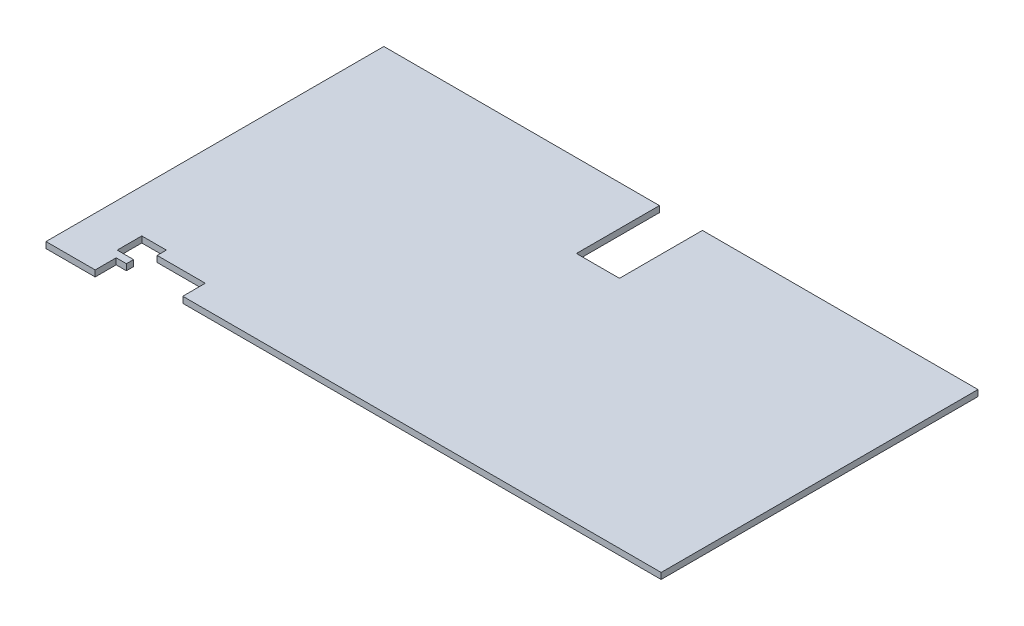
ISO-10303-21;
HEADER;
FILE_DESCRIPTION(('STEP AP214'),'2;1');
FILE_NAME('part.step','',(''),(''),'','','');
FILE_SCHEMA(('AUTOMOTIVE_DESIGN { 1 0 10303 214 1 1 1 1 }'));
ENDSEC;
DATA;
#1=APPLICATION_CONTEXT('core data for automotive mechanical design processes');
#2=APPLICATION_PROTOCOL_DEFINITION('international standard','automotive_design',2000,#1);
#3=PRODUCT_CONTEXT('',#1,'mechanical');
#4=PRODUCT('Part','Part','',(#3));
#5=PRODUCT_RELATED_PRODUCT_CATEGORY('part','',(#4));
#6=PRODUCT_DEFINITION_FORMATION('','',#4);
#7=PRODUCT_DEFINITION_CONTEXT('part definition',#1,'design');
#8=PRODUCT_DEFINITION('design','',#6,#7);
#9=PRODUCT_DEFINITION_SHAPE('','',#8);
#10=(LENGTH_UNIT() NAMED_UNIT(*) SI_UNIT(.MILLI.,.METRE.));
#11=(NAMED_UNIT(*) PLANE_ANGLE_UNIT() SI_UNIT($,.RADIAN.));
#12=(NAMED_UNIT(*) SI_UNIT($,.STERADIAN.) SOLID_ANGLE_UNIT());
#13=UNCERTAINTY_MEASURE_WITH_UNIT(LENGTH_MEASURE(1.E-05),#10,'distance_accuracy_value','');
#14=(GEOMETRIC_REPRESENTATION_CONTEXT(3) GLOBAL_UNCERTAINTY_ASSIGNED_CONTEXT((#13)) GLOBAL_UNIT_ASSIGNED_CONTEXT((#10,
#11,#12)) REPRESENTATION_CONTEXT('',''));
#15=CARTESIAN_POINT('',(0.,0.,0.));
#16=DIRECTION('',(0.,0.,1.));
#17=DIRECTION('',(1.,0.,0.));
#18=AXIS2_PLACEMENT_3D('',#15,#16,#17);
#19=CARTESIAN_POINT('',(145.,3.,77.325));
#20=DIRECTION('',(0.,0.,-1.));
#21=DIRECTION('',(-1.,0.,0.));
#22=AXIS2_PLACEMENT_3D('',#19,#20,#21);
#23=PLANE('',#22);
#24=DIRECTION('',(0.,1.,0.));
#25=VECTOR('',#24,1.);
#26=CARTESIAN_POINT('',(-88.4999999999999,0.,77.325));
#27=LINE('',#26,#25);
#28=CARTESIAN_POINT('',(-88.4999999999999,0.,77.325));
#29=VERTEX_POINT('',#28);
#30=CARTESIAN_POINT('',(-88.4999999999999,3.,77.325));
#31=VERTEX_POINT('',#30);
#32=EDGE_CURVE('E232',#29,#31,#27,.T.);
#33=ORIENTED_EDGE('',*,*,#32,.F.);
#34=DIRECTION('',(1.,0.,0.));
#35=VECTOR('',#34,1.);
#36=CARTESIAN_POINT('',(145.,0.,77.325));
#37=LINE('',#36,#35);
#38=CARTESIAN_POINT('',(145.,0.,77.325));
#39=VERTEX_POINT('',#38);
#40=EDGE_CURVE('E170',#29,#39,#37,.T.);
#41=ORIENTED_EDGE('',*,*,#40,.T.);
#42=DIRECTION('',(0.,-1.,0.));
#43=VECTOR('',#42,1.);
#44=CARTESIAN_POINT('',(145.,3.,77.325));
#45=LINE('',#44,#43);
#46=CARTESIAN_POINT('',(145.,3.,77.325));
#47=VERTEX_POINT('',#46);
#48=EDGE_CURVE('E11',#47,#39,#45,.T.);
#49=ORIENTED_EDGE('',*,*,#48,.F.);
#50=DIRECTION('',(1.,0.,0.));
#51=VECTOR('',#50,1.);
#52=CARTESIAN_POINT('',(145.,3.,77.325));
#53=LINE('',#52,#51);
#54=EDGE_CURVE('E275',#31,#47,#53,.T.);
#55=ORIENTED_EDGE('',*,*,#54,.F.);
#56=EDGE_LOOP('',(#33,#41,#49,#55));
#57=FACE_BOUND('',#56,.T.);
#58=ADVANCED_FACE('F36',(#57),#23,.F.);
#59=CARTESIAN_POINT('',(-121.,3.,77.325));
#60=VERTEX_POINT('',#59);
#61=CARTESIAN_POINT('',(-116.,3.,77.325));
#62=VERTEX_POINT('',#61);
#63=EDGE_CURVE('E51',#60,#62,#53,.T.);
#64=ORIENTED_EDGE('',*,*,#63,.F.);
#65=DIRECTION('',(0.,1.,0.));
#66=VECTOR('',#65,1.);
#67=CARTESIAN_POINT('',(-121.,0.,77.325));
#68=LINE('',#67,#66);
#69=CARTESIAN_POINT('',(-121.,0.,77.325));
#70=VERTEX_POINT('',#69);
#71=EDGE_CURVE('E55',#70,#60,#68,.T.);
#72=ORIENTED_EDGE('',*,*,#71,.F.);
#73=CARTESIAN_POINT('',(-116.,0.,77.325));
#74=VERTEX_POINT('',#73);
#75=EDGE_CURVE('E284',#70,#74,#37,.T.);
#76=ORIENTED_EDGE('',*,*,#75,.T.);
#77=DIRECTION('',(0.,1.,0.));
#78=VECTOR('',#77,1.);
#79=CARTESIAN_POINT('',(-116.,0.,77.325));
#80=LINE('',#79,#78);
#81=EDGE_CURVE('E235',#74,#62,#80,.T.);
#82=ORIENTED_EDGE('',*,*,#81,.T.);
#83=EDGE_LOOP('',(#64,#72,#76,#82));
#84=FACE_BOUND('',#83,.T.);
#85=ADVANCED_FACE('F346',(#84),#23,.F.);
#86=CARTESIAN_POINT('',(0.,3.,0.));
#87=DIRECTION('',(0.,-1.,0.));
#88=DIRECTION('',(0.,0.,-1.));
#89=AXIS2_PLACEMENT_3D('',#86,#87,#88);
#90=PLANE('',#89);
#91=DIRECTION('',(0.,0.,1.));
#92=VECTOR('',#91,1.);
#93=CARTESIAN_POINT('',(-88.4999999999999,3.,0.));
#94=LINE('',#93,#92);
#95=CARTESIAN_POINT('',(-88.4999999999999,3.,66.325));
#96=VERTEX_POINT('',#95);
#97=EDGE_CURVE('E194',#96,#31,#94,.T.);
#98=ORIENTED_EDGE('',*,*,#97,.T.);
#99=ORIENTED_EDGE('',*,*,#54,.T.);
#100=DIRECTION('',(0.,0.,-1.));
#101=VECTOR('',#100,1.);
#102=CARTESIAN_POINT('',(145.,3.,-77.325));
#103=LINE('',#102,#101);
#104=CARTESIAN_POINT('',(145.,3.,-77.325));
#105=VERTEX_POINT('',#104);
#106=EDGE_CURVE('E278',#47,#105,#103,.T.);
#107=ORIENTED_EDGE('',*,*,#106,.T.);
#108=DIRECTION('',(-1.,0.,0.));
#109=VECTOR('',#108,1.);
#110=CARTESIAN_POINT('',(145.,3.,-77.325));
#111=LINE('',#110,#109);
#112=CARTESIAN_POINT('',(10.5,3.,-77.325));
#113=VERTEX_POINT('',#112);
#114=EDGE_CURVE('E281',#105,#113,#111,.T.);
#115=ORIENTED_EDGE('',*,*,#114,.T.);
#116=DIRECTION('',(0.,0.,1.));
#117=VECTOR('',#116,1.);
#118=CARTESIAN_POINT('',(10.5,3.,0.));
#119=LINE('',#118,#117);
#120=CARTESIAN_POINT('',(10.5,3.,-36.825));
#121=VERTEX_POINT('',#120);
#122=EDGE_CURVE('E252',#113,#121,#119,.T.);
#123=ORIENTED_EDGE('',*,*,#122,.T.);
#124=DIRECTION('',(1.,0.,0.));
#125=VECTOR('',#124,1.);
#126=CARTESIAN_POINT('',(0.,3.,-36.825));
#127=LINE('',#126,#125);
#128=CARTESIAN_POINT('',(-10.5,3.,-36.825));
#129=VERTEX_POINT('',#128);
#130=EDGE_CURVE('E261',#129,#121,#127,.T.);
#131=ORIENTED_EDGE('',*,*,#130,.F.);
#132=DIRECTION('',(0.,0.,1.));
#133=VECTOR('',#132,1.);
#134=CARTESIAN_POINT('',(-10.5,3.,0.));
#135=LINE('',#134,#133);
#136=CARTESIAN_POINT('',(-10.5,3.,-77.325));
#137=VERTEX_POINT('',#136);
#138=EDGE_CURVE('E234',#137,#129,#135,.T.);
#139=ORIENTED_EDGE('',*,*,#138,.F.);
#140=CARTESIAN_POINT('',(-145.,3.,-77.325));
#141=VERTEX_POINT('',#140);
#142=EDGE_CURVE('E280',#137,#141,#111,.T.);
#143=ORIENTED_EDGE('',*,*,#142,.T.);
#144=DIRECTION('',(0.,0.,1.));
#145=VECTOR('',#144,1.);
#146=CARTESIAN_POINT('',(-145.,3.,-77.325));
#147=LINE('',#146,#145);
#148=CARTESIAN_POINT('',(-145.,3.,87.5749999999999));
#149=VERTEX_POINT('',#148);
#150=EDGE_CURVE('E273',#141,#149,#147,.T.);
#151=ORIENTED_EDGE('',*,*,#150,.T.);
#152=DIRECTION('',(1.,0.,0.));
#153=VECTOR('',#152,1.);
#154=CARTESIAN_POINT('',(-145.,3.,87.5749999999999));
#155=LINE('',#154,#153);
#156=CARTESIAN_POINT('',(-121.,3.,87.5749999999999));
#157=VERTEX_POINT('',#156);
#158=EDGE_CURVE('E178',#149,#157,#155,.T.);
#159=ORIENTED_EDGE('',*,*,#158,.T.);
#160=DIRECTION('',(0.,0.,-1.));
#161=VECTOR('',#160,1.);
#162=CARTESIAN_POINT('',(-121.,3.,77.325));
#163=LINE('',#162,#161);
#164=EDGE_CURVE('E186',#157,#60,#163,.T.);
#165=ORIENTED_EDGE('',*,*,#164,.T.);
#166=ORIENTED_EDGE('',*,*,#63,.T.);
#167=DIRECTION('',(0.,0.,-1.));
#168=VECTOR('',#167,1.);
#169=CARTESIAN_POINT('',(-116.,3.,0.));
#170=LINE('',#169,#168);
#171=CARTESIAN_POINT('',(-116.,3.,73.825));
#172=VERTEX_POINT('',#171);
#173=EDGE_CURVE('E199',#62,#172,#170,.T.);
#174=ORIENTED_EDGE('',*,*,#173,.T.);
#175=DIRECTION('',(-1.,0.,0.));
#176=VECTOR('',#175,1.);
#177=CARTESIAN_POINT('',(0.,3.,73.825));
#178=LINE('',#177,#176);
#179=CARTESIAN_POINT('',(-124.,3.,73.825));
#180=VERTEX_POINT('',#179);
#181=EDGE_CURVE('E227',#172,#180,#178,.T.);
#182=ORIENTED_EDGE('',*,*,#181,.T.);
#183=DIRECTION('',(0.,0.,-1.));
#184=VECTOR('',#183,1.);
#185=CARTESIAN_POINT('',(-124.,3.,0.));
#186=LINE('',#185,#184);
#187=CARTESIAN_POINT('',(-124.,3.,61.825));
#188=VERTEX_POINT('',#187);
#189=EDGE_CURVE('E224',#180,#188,#186,.T.);
#190=ORIENTED_EDGE('',*,*,#189,.T.);
#191=DIRECTION('',(1.,0.,0.));
#192=VECTOR('',#191,1.);
#193=CARTESIAN_POINT('',(0.,3.,61.825));
#194=LINE('',#193,#192);
#195=CARTESIAN_POINT('',(-112.,3.,61.825));
#196=VERTEX_POINT('',#195);
#197=EDGE_CURVE('E221',#188,#196,#194,.T.);
#198=ORIENTED_EDGE('',*,*,#197,.T.);
#199=DIRECTION('',(0.,0.,1.));
#200=VECTOR('',#199,1.);
#201=CARTESIAN_POINT('',(-112.,3.,-3.4540271877227E-13));
#202=LINE('',#201,#200);
#203=CARTESIAN_POINT('',(-112.,3.,66.325));
#204=VERTEX_POINT('',#203);
#205=EDGE_CURVE('E218',#196,#204,#202,.T.);
#206=ORIENTED_EDGE('',*,*,#205,.T.);
#207=DIRECTION('',(1.,0.,0.));
#208=VECTOR('',#207,1.);
#209=CARTESIAN_POINT('',(0.,3.,66.325));
#210=LINE('',#209,#208);
#211=EDGE_CURVE('E215',#204,#96,#210,.T.);
#212=ORIENTED_EDGE('',*,*,#211,.T.);
#213=EDGE_LOOP('',(#98,#99,#107,#115,#123,#131,#139,#143,#151,#159,#165,#166,#174,#182,#190,
#198,#206,#212));
#214=FACE_BOUND('',#213,.T.);
#215=ADVANCED_FACE('F305',(#214),#90,.F.);
#216=CARTESIAN_POINT('',(0.,0.,0.));
#217=DIRECTION('',(0.,-1.,0.));
#218=DIRECTION('',(0.,0.,-1.));
#219=AXIS2_PLACEMENT_3D('',#216,#217,#218);
#220=PLANE('',#219);
#221=ORIENTED_EDGE('',*,*,#40,.F.);
#222=DIRECTION('',(0.,0.,1.));
#223=VECTOR('',#222,1.);
#224=CARTESIAN_POINT('',(-88.4999999999999,0.,0.));
#225=LINE('',#224,#223);
#226=CARTESIAN_POINT('',(-88.4999999999999,0.,66.325));
#227=VERTEX_POINT('',#226);
#228=EDGE_CURVE('E196',#227,#29,#225,.T.);
#229=ORIENTED_EDGE('',*,*,#228,.F.);
#230=DIRECTION('',(1.,0.,0.));
#231=VECTOR('',#230,1.);
#232=CARTESIAN_POINT('',(0.,0.,66.325));
#233=LINE('',#232,#231);
#234=CARTESIAN_POINT('',(-112.,0.,66.325));
#235=VERTEX_POINT('',#234);
#236=EDGE_CURVE('E198',#235,#227,#233,.T.);
#237=ORIENTED_EDGE('',*,*,#236,.F.);
#238=DIRECTION('',(0.,0.,1.));
#239=VECTOR('',#238,1.);
#240=CARTESIAN_POINT('',(-112.,0.,-3.4540271877227E-13));
#241=LINE('',#240,#239);
#242=CARTESIAN_POINT('',(-112.,0.,61.825));
#243=VERTEX_POINT('',#242);
#244=EDGE_CURVE('E201',#243,#235,#241,.T.);
#245=ORIENTED_EDGE('',*,*,#244,.F.);
#246=DIRECTION('',(1.,0.,0.));
#247=VECTOR('',#246,1.);
#248=CARTESIAN_POINT('',(0.,0.,61.825));
#249=LINE('',#248,#247);
#250=CARTESIAN_POINT('',(-124.,0.,61.825));
#251=VERTEX_POINT('',#250);
#252=EDGE_CURVE('E204',#251,#243,#249,.T.);
#253=ORIENTED_EDGE('',*,*,#252,.F.);
#254=DIRECTION('',(0.,0.,-1.));
#255=VECTOR('',#254,1.);
#256=CARTESIAN_POINT('',(-124.,0.,0.));
#257=LINE('',#256,#255);
#258=CARTESIAN_POINT('',(-124.,0.,73.825));
#259=VERTEX_POINT('',#258);
#260=EDGE_CURVE('E206',#259,#251,#257,.T.);
#261=ORIENTED_EDGE('',*,*,#260,.F.);
#262=DIRECTION('',(-1.,0.,0.));
#263=VECTOR('',#262,1.);
#264=CARTESIAN_POINT('',(0.,0.,73.825));
#265=LINE('',#264,#263);
#266=CARTESIAN_POINT('',(-116.,0.,73.825));
#267=VERTEX_POINT('',#266);
#268=EDGE_CURVE('E208',#267,#259,#265,.T.);
#269=ORIENTED_EDGE('',*,*,#268,.F.);
#270=DIRECTION('',(0.,0.,-1.));
#271=VECTOR('',#270,1.);
#272=CARTESIAN_POINT('',(-116.,0.,0.));
#273=LINE('',#272,#271);
#274=EDGE_CURVE('E210',#74,#267,#273,.T.);
#275=ORIENTED_EDGE('',*,*,#274,.F.);
#276=ORIENTED_EDGE('',*,*,#75,.F.);
#277=DIRECTION('',(0.,0.,-1.));
#278=VECTOR('',#277,1.);
#279=CARTESIAN_POINT('',(-121.,0.,77.325));
#280=LINE('',#279,#278);
#281=CARTESIAN_POINT('',(-121.,0.,87.5749999999999));
#282=VERTEX_POINT('',#281);
#283=EDGE_CURVE('E180',#282,#70,#280,.T.);
#284=ORIENTED_EDGE('',*,*,#283,.F.);
#285=DIRECTION('',(1.,0.,0.));
#286=VECTOR('',#285,1.);
#287=CARTESIAN_POINT('',(-145.,0.,87.5749999999999));
#288=LINE('',#287,#286);
#289=CARTESIAN_POINT('',(-145.,0.,87.5749999999999));
#290=VERTEX_POINT('',#289);
#291=EDGE_CURVE('E176',#290,#282,#288,.T.);
#292=ORIENTED_EDGE('',*,*,#291,.F.);
#293=DIRECTION('',(0.,0.,1.));
#294=VECTOR('',#293,1.);
#295=CARTESIAN_POINT('',(-145.,0.,-77.325));
#296=LINE('',#295,#294);
#297=CARTESIAN_POINT('',(-145.,0.,-77.325));
#298=VERTEX_POINT('',#297);
#299=EDGE_CURVE('E160',#298,#290,#296,.T.);
#300=ORIENTED_EDGE('',*,*,#299,.F.);
#301=DIRECTION('',(-1.,0.,0.));
#302=VECTOR('',#301,1.);
#303=CARTESIAN_POINT('',(145.,0.,-77.325));
#304=LINE('',#303,#302);
#305=CARTESIAN_POINT('',(-10.5,0.,-77.325));
#306=VERTEX_POINT('',#305);
#307=EDGE_CURVE('E288',#306,#298,#304,.T.);
#308=ORIENTED_EDGE('',*,*,#307,.F.);
#309=DIRECTION('',(0.,0.,1.));
#310=VECTOR('',#309,1.);
#311=CARTESIAN_POINT('',(-10.5,0.,0.));
#312=LINE('',#311,#310);
#313=CARTESIAN_POINT('',(-10.5,0.,-36.825));
#314=VERTEX_POINT('',#313);
#315=EDGE_CURVE('E248',#306,#314,#312,.T.);
#316=ORIENTED_EDGE('',*,*,#315,.T.);
#317=DIRECTION('',(1.,0.,0.));
#318=VECTOR('',#317,1.);
#319=CARTESIAN_POINT('',(0.,0.,-36.825));
#320=LINE('',#319,#318);
#321=CARTESIAN_POINT('',(10.5,0.,-36.825));
#322=VERTEX_POINT('',#321);
#323=EDGE_CURVE('E251',#314,#322,#320,.T.);
#324=ORIENTED_EDGE('',*,*,#323,.T.);
#325=DIRECTION('',(0.,0.,1.));
#326=VECTOR('',#325,1.);
#327=CARTESIAN_POINT('',(10.5,0.,0.));
#328=LINE('',#327,#326);
#329=CARTESIAN_POINT('',(10.5,0.,-77.325));
#330=VERTEX_POINT('',#329);
#331=EDGE_CURVE('E255',#330,#322,#328,.T.);
#332=ORIENTED_EDGE('',*,*,#331,.F.);
#333=CARTESIAN_POINT('',(145.,0.,-77.325));
#334=VERTEX_POINT('',#333);
#335=EDGE_CURVE('E276',#334,#330,#304,.T.);
#336=ORIENTED_EDGE('',*,*,#335,.F.);
#337=DIRECTION('',(0.,0.,-1.));
#338=VECTOR('',#337,1.);
#339=CARTESIAN_POINT('',(145.,0.,-77.325));
#340=LINE('',#339,#338);
#341=EDGE_CURVE('E286',#39,#334,#340,.T.);
#342=ORIENTED_EDGE('',*,*,#341,.F.);
#343=EDGE_LOOP('',(#221,#229,#237,#245,#253,#261,#269,#275,#276,#284,#292,#300,#308,#316,#324,
#332,#336,#342));
#344=FACE_BOUND('',#343,.T.);
#345=ADVANCED_FACE('F184',(#344),#220,.T.);
#346=CARTESIAN_POINT('',(145.,3.,-77.325));
#347=DIRECTION('',(0.,0.,1.));
#348=DIRECTION('',(1.,0.,0.));
#349=AXIS2_PLACEMENT_3D('',#346,#347,#348);
#350=PLANE('',#349);
#351=DIRECTION('',(0.,1.,0.));
#352=VECTOR('',#351,1.);
#353=CARTESIAN_POINT('',(10.5,0.,-77.325));
#354=LINE('',#353,#352);
#355=EDGE_CURVE('E267',#330,#113,#354,.T.);
#356=ORIENTED_EDGE('',*,*,#355,.T.);
#357=ORIENTED_EDGE('',*,*,#114,.F.);
#358=DIRECTION('',(0.,-1.,0.));
#359=VECTOR('',#358,1.);
#360=CARTESIAN_POINT('',(145.,3.,-77.325));
#361=LINE('',#360,#359);
#362=EDGE_CURVE('E44',#105,#334,#361,.T.);
#363=ORIENTED_EDGE('',*,*,#362,.T.);
#364=ORIENTED_EDGE('',*,*,#335,.T.);
#365=EDGE_LOOP('',(#356,#357,#363,#364));
#366=FACE_BOUND('',#365,.T.);
#367=ADVANCED_FACE('F296',(#366),#350,.F.);
#368=CARTESIAN_POINT('',(-145.,3.,-77.325));
#369=DIRECTION('',(1.,0.,0.));
#370=DIRECTION('',(0.,0.,-1.));
#371=AXIS2_PLACEMENT_3D('',#368,#369,#370);
#372=PLANE('',#371);
#373=ORIENTED_EDGE('',*,*,#299,.T.);
#374=DIRECTION('',(0.,1.,0.));
#375=VECTOR('',#374,1.);
#376=CARTESIAN_POINT('',(-145.,0.,87.5749999999999));
#377=LINE('',#376,#375);
#378=EDGE_CURVE('E163',#290,#149,#377,.T.);
#379=ORIENTED_EDGE('',*,*,#378,.T.);
#380=ORIENTED_EDGE('',*,*,#150,.F.);
#381=DIRECTION('',(0.,-1.,0.));
#382=VECTOR('',#381,1.);
#383=CARTESIAN_POINT('',(-145.,3.,-77.325));
#384=LINE('',#383,#382);
#385=EDGE_CURVE('E166',#141,#298,#384,.T.);
#386=ORIENTED_EDGE('',*,*,#385,.T.);
#387=EDGE_LOOP('',(#373,#379,#380,#386));
#388=FACE_BOUND('',#387,.T.);
#389=ADVANCED_FACE('F38',(#388),#372,.F.);
#390=CARTESIAN_POINT('',(145.,3.,-77.325));
#391=DIRECTION('',(-1.,0.,0.));
#392=DIRECTION('',(0.,0.,1.));
#393=AXIS2_PLACEMENT_3D('',#390,#391,#392);
#394=PLANE('',#393);
#395=ORIENTED_EDGE('',*,*,#341,.T.);
#396=ORIENTED_EDGE('',*,*,#362,.F.);
#397=ORIENTED_EDGE('',*,*,#106,.F.);
#398=ORIENTED_EDGE('',*,*,#48,.T.);
#399=EDGE_LOOP('',(#395,#396,#397,#398));
#400=FACE_BOUND('',#399,.T.);
#401=ADVANCED_FACE('F309',(#400),#394,.F.);
#402=ORIENTED_EDGE('',*,*,#142,.F.);
#403=DIRECTION('',(0.,1.,0.));
#404=VECTOR('',#403,1.);
#405=CARTESIAN_POINT('',(-10.5,0.,-77.325));
#406=LINE('',#405,#404);
#407=EDGE_CURVE('E171',#306,#137,#406,.T.);
#408=ORIENTED_EDGE('',*,*,#407,.F.);
#409=ORIENTED_EDGE('',*,*,#307,.T.);
#410=ORIENTED_EDGE('',*,*,#385,.F.);
#411=EDGE_LOOP('',(#402,#408,#409,#410));
#412=FACE_BOUND('',#411,.T.);
#413=ADVANCED_FACE('F356',(#412),#350,.F.);
#414=CARTESIAN_POINT('',(-10.5,0.,0.));
#415=DIRECTION('',(-1.,0.,0.));
#416=DIRECTION('',(0.,0.,1.));
#417=AXIS2_PLACEMENT_3D('',#414,#415,#416);
#418=PLANE('',#417);
#419=ORIENTED_EDGE('',*,*,#138,.T.);
#420=DIRECTION('',(0.,1.,0.));
#421=VECTOR('',#420,1.);
#422=CARTESIAN_POINT('',(-10.5,0.,-36.825));
#423=LINE('',#422,#421);
#424=EDGE_CURVE('E258',#314,#129,#423,.T.);
#425=ORIENTED_EDGE('',*,*,#424,.F.);
#426=ORIENTED_EDGE('',*,*,#315,.F.);
#427=ORIENTED_EDGE('',*,*,#407,.T.);
#428=EDGE_LOOP('',(#419,#425,#426,#427));
#429=FACE_BOUND('',#428,.T.);
#430=ADVANCED_FACE('F359',(#429),#418,.F.);
#431=CARTESIAN_POINT('',(10.5,0.,0.));
#432=DIRECTION('',(-1.,0.,0.));
#433=DIRECTION('',(0.,0.,1.));
#434=AXIS2_PLACEMENT_3D('',#431,#432,#433);
#435=PLANE('',#434);
#436=ORIENTED_EDGE('',*,*,#122,.F.);
#437=ORIENTED_EDGE('',*,*,#355,.F.);
#438=ORIENTED_EDGE('',*,*,#331,.T.);
#439=DIRECTION('',(0.,1.,0.));
#440=VECTOR('',#439,1.);
#441=CARTESIAN_POINT('',(10.5,0.,-36.825));
#442=LINE('',#441,#440);
#443=EDGE_CURVE('E270',#322,#121,#442,.T.);
#444=ORIENTED_EDGE('',*,*,#443,.T.);
#445=EDGE_LOOP('',(#436,#437,#438,#444));
#446=FACE_BOUND('',#445,.T.);
#447=ADVANCED_FACE('F303',(#446),#435,.T.);
#448=CARTESIAN_POINT('',(0.,0.,-36.825));
#449=DIRECTION('',(0.,0.,1.));
#450=DIRECTION('',(1.,0.,0.));
#451=AXIS2_PLACEMENT_3D('',#448,#449,#450);
#452=PLANE('',#451);
#453=ORIENTED_EDGE('',*,*,#130,.T.);
#454=ORIENTED_EDGE('',*,*,#443,.F.);
#455=ORIENTED_EDGE('',*,*,#323,.F.);
#456=ORIENTED_EDGE('',*,*,#424,.T.);
#457=EDGE_LOOP('',(#453,#454,#455,#456));
#458=FACE_BOUND('',#457,.T.);
#459=ADVANCED_FACE('F366',(#458),#452,.F.);
#460=CARTESIAN_POINT('',(-88.4999999999999,0.,0.));
#461=DIRECTION('',(-1.,0.,0.));
#462=DIRECTION('',(0.,0.,1.));
#463=AXIS2_PLACEMENT_3D('',#460,#461,#462);
#464=PLANE('',#463);
#465=ORIENTED_EDGE('',*,*,#97,.F.);
#466=DIRECTION('',(0.,1.,0.));
#467=VECTOR('',#466,1.);
#468=CARTESIAN_POINT('',(-88.4999999999999,0.,66.325));
#469=LINE('',#468,#467);
#470=EDGE_CURVE('E212',#227,#96,#469,.T.);
#471=ORIENTED_EDGE('',*,*,#470,.F.);
#472=ORIENTED_EDGE('',*,*,#228,.T.);
#473=ORIENTED_EDGE('',*,*,#32,.T.);
#474=EDGE_LOOP('',(#465,#471,#472,#473));
#475=FACE_BOUND('',#474,.T.);
#476=ADVANCED_FACE('F318',(#475),#464,.T.);
#477=CARTESIAN_POINT('',(-116.,0.,0.));
#478=DIRECTION('',(1.,0.,0.));
#479=DIRECTION('',(0.,0.,-1.));
#480=AXIS2_PLACEMENT_3D('',#477,#478,#479);
#481=PLANE('',#480);
#482=ORIENTED_EDGE('',*,*,#173,.F.);
#483=ORIENTED_EDGE('',*,*,#81,.F.);
#484=ORIENTED_EDGE('',*,*,#274,.T.);
#485=DIRECTION('',(0.,1.,0.));
#486=VECTOR('',#485,1.);
#487=CARTESIAN_POINT('',(-116.,0.,73.825));
#488=LINE('',#487,#486);
#489=EDGE_CURVE('E237',#267,#172,#488,.T.);
#490=ORIENTED_EDGE('',*,*,#489,.T.);
#491=EDGE_LOOP('',(#482,#483,#484,#490));
#492=FACE_BOUND('',#491,.T.);
#493=ADVANCED_FACE('F345',(#492),#481,.T.);
#494=CARTESIAN_POINT('',(0.,0.,73.825));
#495=DIRECTION('',(0.,0.,-1.));
#496=DIRECTION('',(-1.,0.,0.));
#497=AXIS2_PLACEMENT_3D('',#494,#495,#496);
#498=PLANE('',#497);
#499=ORIENTED_EDGE('',*,*,#181,.F.);
#500=ORIENTED_EDGE('',*,*,#489,.F.);
#501=ORIENTED_EDGE('',*,*,#268,.T.);
#502=DIRECTION('',(0.,1.,0.));
#503=VECTOR('',#502,1.);
#504=CARTESIAN_POINT('',(-124.,0.,73.825));
#505=LINE('',#504,#503);
#506=EDGE_CURVE('E239',#259,#180,#505,.T.);
#507=ORIENTED_EDGE('',*,*,#506,.T.);
#508=EDGE_LOOP('',(#499,#500,#501,#507));
#509=FACE_BOUND('',#508,.T.);
#510=ADVANCED_FACE('F339',(#509),#498,.T.);
#511=CARTESIAN_POINT('',(-124.,0.,0.));
#512=DIRECTION('',(1.,0.,0.));
#513=DIRECTION('',(0.,0.,-1.));
#514=AXIS2_PLACEMENT_3D('',#511,#512,#513);
#515=PLANE('',#514);
#516=ORIENTED_EDGE('',*,*,#189,.F.);
#517=ORIENTED_EDGE('',*,*,#506,.F.);
#518=ORIENTED_EDGE('',*,*,#260,.T.);
#519=DIRECTION('',(0.,1.,0.));
#520=VECTOR('',#519,1.);
#521=CARTESIAN_POINT('',(-124.,0.,61.825));
#522=LINE('',#521,#520);
#523=EDGE_CURVE('E241',#251,#188,#522,.T.);
#524=ORIENTED_EDGE('',*,*,#523,.T.);
#525=EDGE_LOOP('',(#516,#517,#518,#524));
#526=FACE_BOUND('',#525,.T.);
#527=ADVANCED_FACE('F335',(#526),#515,.T.);
#528=CARTESIAN_POINT('',(0.,0.,61.825));
#529=DIRECTION('',(0.,0.,1.));
#530=DIRECTION('',(1.,0.,0.));
#531=AXIS2_PLACEMENT_3D('',#528,#529,#530);
#532=PLANE('',#531);
#533=ORIENTED_EDGE('',*,*,#197,.F.);
#534=ORIENTED_EDGE('',*,*,#523,.F.);
#535=ORIENTED_EDGE('',*,*,#252,.T.);
#536=DIRECTION('',(0.,1.,0.));
#537=VECTOR('',#536,1.);
#538=CARTESIAN_POINT('',(-112.,0.,61.825));
#539=LINE('',#538,#537);
#540=EDGE_CURVE('E243',#243,#196,#539,.T.);
#541=ORIENTED_EDGE('',*,*,#540,.T.);
#542=EDGE_LOOP('',(#533,#534,#535,#541));
#543=FACE_BOUND('',#542,.T.);
#544=ADVANCED_FACE('F332',(#543),#532,.T.);
#545=CARTESIAN_POINT('',(-112.,0.,-3.4540271877227E-13));
#546=DIRECTION('',(-1.,0.,0.));
#547=DIRECTION('',(0.,0.,1.));
#548=AXIS2_PLACEMENT_3D('',#545,#546,#547);
#549=PLANE('',#548);
#550=ORIENTED_EDGE('',*,*,#205,.F.);
#551=ORIENTED_EDGE('',*,*,#540,.F.);
#552=ORIENTED_EDGE('',*,*,#244,.T.);
#553=DIRECTION('',(0.,1.,0.));
#554=VECTOR('',#553,1.);
#555=CARTESIAN_POINT('',(-112.,0.,66.325));
#556=LINE('',#555,#554);
#557=EDGE_CURVE('E245',#235,#204,#556,.T.);
#558=ORIENTED_EDGE('',*,*,#557,.T.);
#559=EDGE_LOOP('',(#550,#551,#552,#558));
#560=FACE_BOUND('',#559,.T.);
#561=ADVANCED_FACE('F325',(#560),#549,.T.);
#562=CARTESIAN_POINT('',(0.,0.,66.325));
#563=DIRECTION('',(0.,0.,1.));
#564=DIRECTION('',(1.,0.,0.));
#565=AXIS2_PLACEMENT_3D('',#562,#563,#564);
#566=PLANE('',#565);
#567=ORIENTED_EDGE('',*,*,#211,.F.);
#568=ORIENTED_EDGE('',*,*,#557,.F.);
#569=ORIENTED_EDGE('',*,*,#236,.T.);
#570=ORIENTED_EDGE('',*,*,#470,.T.);
#571=EDGE_LOOP('',(#567,#568,#569,#570));
#572=FACE_BOUND('',#571,.T.);
#573=ADVANCED_FACE('F321',(#572),#566,.T.);
#574=CARTESIAN_POINT('',(-121.,0.,77.325));
#575=DIRECTION('',(1.,0.,0.));
#576=DIRECTION('',(0.,0.,-1.));
#577=AXIS2_PLACEMENT_3D('',#574,#575,#576);
#578=PLANE('',#577);
#579=ORIENTED_EDGE('',*,*,#164,.F.);
#580=DIRECTION('',(0.,1.,0.));
#581=VECTOR('',#580,1.);
#582=CARTESIAN_POINT('',(-121.,0.,87.5749999999999));
#583=LINE('',#582,#581);
#584=EDGE_CURVE('E179',#282,#157,#583,.T.);
#585=ORIENTED_EDGE('',*,*,#584,.F.);
#586=ORIENTED_EDGE('',*,*,#283,.T.);
#587=ORIENTED_EDGE('',*,*,#71,.T.);
#588=EDGE_LOOP('',(#579,#585,#586,#587));
#589=FACE_BOUND('',#588,.T.);
#590=ADVANCED_FACE('F376',(#589),#578,.T.);
#591=CARTESIAN_POINT('',(-145.,0.,87.5749999999999));
#592=DIRECTION('',(0.,0.,1.));
#593=DIRECTION('',(1.,0.,0.));
#594=AXIS2_PLACEMENT_3D('',#591,#592,#593);
#595=PLANE('',#594);
#596=ORIENTED_EDGE('',*,*,#158,.F.);
#597=ORIENTED_EDGE('',*,*,#378,.F.);
#598=ORIENTED_EDGE('',*,*,#291,.T.);
#599=ORIENTED_EDGE('',*,*,#584,.T.);
#600=EDGE_LOOP('',(#596,#597,#598,#599));
#601=FACE_BOUND('',#600,.T.);
#602=ADVANCED_FACE('F175',(#601),#595,.T.);
#603=CLOSED_SHELL('',(#58,#85,#215,#345,#367,#389,#401,#413,#430,#447,#459,#476,#493,#510,#527,
#544,#561,#573,#590,#602));
#604=MANIFOLD_SOLID_BREP('B2',#603);
#605=ADVANCED_BREP_SHAPE_REPRESENTATION('',(#18,#604),#14);
#606=SHAPE_DEFINITION_REPRESENTATION(#9,#605);
ENDSEC;
END-ISO-10303-21;
